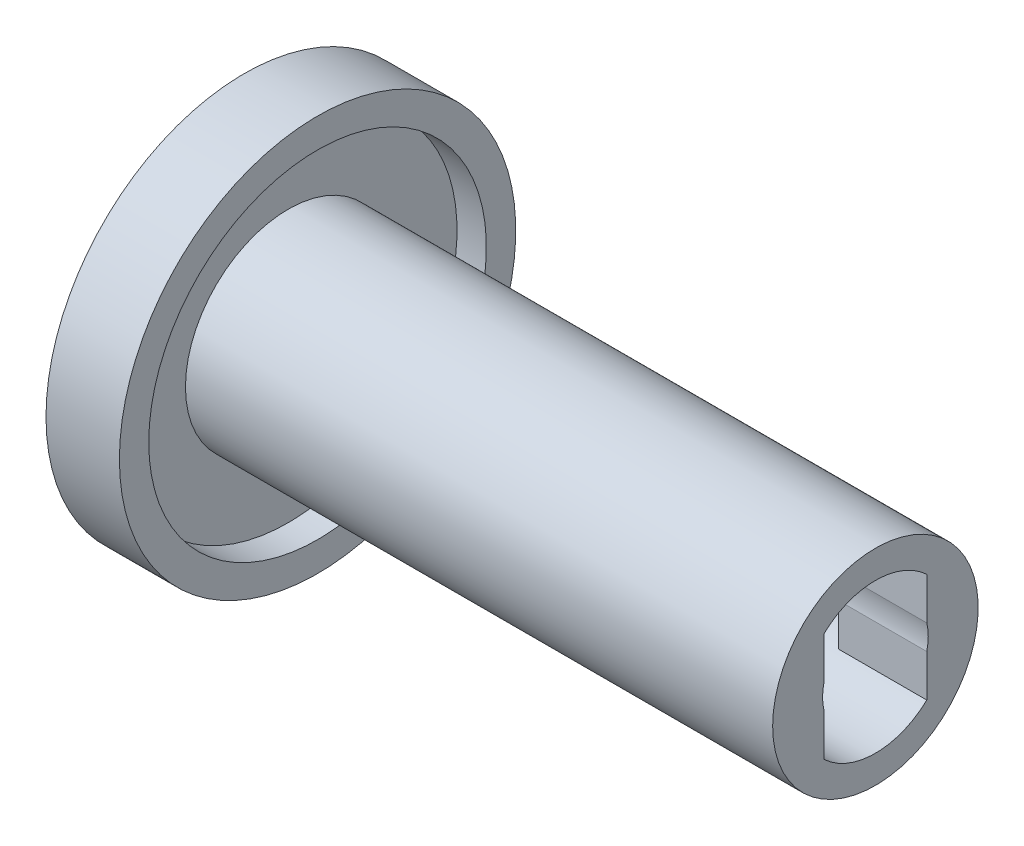
ISO-10303-21;
HEADER;
FILE_DESCRIPTION(('STEP AP214'),'2;1');
FILE_NAME('part.step','',(''),(''),'','','');
FILE_SCHEMA(('AUTOMOTIVE_DESIGN { 1 0 10303 214 1 1 1 1 }'));
ENDSEC;
DATA;
#1=APPLICATION_CONTEXT('core data for automotive mechanical design processes');
#2=APPLICATION_PROTOCOL_DEFINITION('international standard','automotive_design',2000,#1);
#3=PRODUCT_CONTEXT('',#1,'mechanical');
#4=PRODUCT('Part','Part','',(#3));
#5=PRODUCT_RELATED_PRODUCT_CATEGORY('part','',(#4));
#6=PRODUCT_DEFINITION_FORMATION('','',#4);
#7=PRODUCT_DEFINITION_CONTEXT('part definition',#1,'design');
#8=PRODUCT_DEFINITION('design','',#6,#7);
#9=PRODUCT_DEFINITION_SHAPE('','',#8);
#10=(LENGTH_UNIT() NAMED_UNIT(*) SI_UNIT(.MILLI.,.METRE.));
#11=(NAMED_UNIT(*) PLANE_ANGLE_UNIT() SI_UNIT($,.RADIAN.));
#12=(NAMED_UNIT(*) SI_UNIT($,.STERADIAN.) SOLID_ANGLE_UNIT());
#13=UNCERTAINTY_MEASURE_WITH_UNIT(LENGTH_MEASURE(1.E-05),#10,'distance_accuracy_value','');
#14=(GEOMETRIC_REPRESENTATION_CONTEXT(3) GLOBAL_UNCERTAINTY_ASSIGNED_CONTEXT((#13)) GLOBAL_UNIT_ASSIGNED_CONTEXT((#10,
#11,#12)) REPRESENTATION_CONTEXT('',''));
#15=CARTESIAN_POINT('',(0.,0.,0.));
#16=DIRECTION('',(0.,0.,1.));
#17=DIRECTION('',(1.,0.,0.));
#18=AXIS2_PLACEMENT_3D('',#15,#16,#17);
#19=CARTESIAN_POINT('',(-81.7411579050491,0.,0.));
#20=DIRECTION('',(-1.,0.,0.));
#21=DIRECTION('',(0.,0.,1.));
#22=AXIS2_PLACEMENT_3D('',#19,#20,#21);
#23=CYLINDRICAL_SURFACE('',#22,3.6);
#24=CARTESIAN_POINT('',(-25.3586044365278,0.,0.));
#25=DIRECTION('',(-1.,0.,0.));
#26=DIRECTION('',(0.,0.,1.));
#27=AXIS2_PLACEMENT_3D('',#24,#25,#26);
#28=CIRCLE('',#27,3.6);
#29=CARTESIAN_POINT('',(-25.3586044365278,0.842614977317627,-3.5));
#30=VERTEX_POINT('',#29);
#31=CARTESIAN_POINT('',(-25.3586044365278,-0.842614977317625,-3.5));
#32=VERTEX_POINT('',#31);
#33=EDGE_CURVE('E147',#30,#32,#28,.T.);
#34=ORIENTED_EDGE('',*,*,#33,.T.);
#35=DIRECTION('',(-1.,0.,0.));
#36=VECTOR('',#35,1.);
#37=CARTESIAN_POINT('',(-81.7411579050491,-0.842614977317627,-3.5));
#38=LINE('',#37,#36);
#39=CARTESIAN_POINT('',(-19.3586044365278,-0.842614977317627,-3.5));
#40=VERTEX_POINT('',#39);
#41=EDGE_CURVE('E141',#32,#40,#38,.F.);
#42=ORIENTED_EDGE('',*,*,#41,.T.);
#43=CARTESIAN_POINT('',(-19.3586044365278,0.,0.));
#44=DIRECTION('',(-1.,0.,0.));
#45=DIRECTION('',(0.,0.,1.));
#46=AXIS2_PLACEMENT_3D('',#43,#44,#45);
#47=CIRCLE('',#46,3.6);
#48=CARTESIAN_POINT('',(-19.3586044365278,0.842614977317629,-3.5));
#49=VERTEX_POINT('',#48);
#50=EDGE_CURVE('E152',#49,#40,#47,.T.);
#51=ORIENTED_EDGE('',*,*,#50,.F.);
#52=DIRECTION('',(-1.,0.,0.));
#53=VECTOR('',#52,1.);
#54=CARTESIAN_POINT('',(-81.7411579050491,0.842614977317629,-3.5));
#55=LINE('',#54,#53);
#56=EDGE_CURVE('E216',#49,#30,#55,.T.);
#57=ORIENTED_EDGE('',*,*,#56,.T.);
#58=EDGE_LOOP('',(#34,#42,#51,#57));
#59=FACE_BOUND('',#58,.T.);
#60=ADVANCED_FACE('F39',(#59),#23,.F.);
#61=CARTESIAN_POINT('',(-25.3586044365278,3.6,0.));
#62=DIRECTION('',(1.,0.,0.));
#63=DIRECTION('',(0.,0.,-1.));
#64=AXIS2_PLACEMENT_3D('',#61,#62,#63);
#65=PLANE('',#64);
#66=CARTESIAN_POINT('',(-25.3586044365278,0.,0.));
#67=DIRECTION('',(-1.,0.,0.));
#68=DIRECTION('',(0.,0.,1.));
#69=AXIS2_PLACEMENT_3D('',#66,#67,#68);
#70=CIRCLE('',#69,5.1);
#71=CARTESIAN_POINT('',(-25.3586044365278,3.70944739819828,-3.5));
#72=VERTEX_POINT('',#71);
#73=CARTESIAN_POINT('',(-25.3586044365278,-3.70944739819828,-3.5));
#74=VERTEX_POINT('',#73);
#75=EDGE_CURVE('E134',#72,#74,#70,.T.);
#76=ORIENTED_EDGE('',*,*,#75,.T.);
#77=DIRECTION('',(0.,1.,0.));
#78=VECTOR('',#77,1.);
#79=CARTESIAN_POINT('',(-25.3586044365278,3.70944739819828,-3.5));
#80=LINE('',#79,#78);
#81=EDGE_CURVE('E55',#74,#32,#80,.T.);
#82=ORIENTED_EDGE('',*,*,#81,.T.);
#83=ORIENTED_EDGE('',*,*,#33,.F.);
#84=EDGE_CURVE('E220',#30,#72,#80,.T.);
#85=ORIENTED_EDGE('',*,*,#84,.T.);
#86=EDGE_LOOP('',(#76,#82,#83,#85));
#87=FACE_BOUND('',#86,.T.);
#88=ADVANCED_FACE('F219',(#87),#65,.F.);
#89=CARTESIAN_POINT('',(-59.3586044365278,5.1,0.));
#90=DIRECTION('',(-1.,0.,0.));
#91=DIRECTION('',(0.,0.,1.));
#92=AXIS2_PLACEMENT_3D('',#89,#90,#91);
#93=PLANE('',#92);
#94=CARTESIAN_POINT('',(-59.3586044365278,0.,0.));
#95=DIRECTION('',(-1.,0.,0.));
#96=DIRECTION('',(0.,0.,1.));
#97=AXIS2_PLACEMENT_3D('',#94,#95,#96);
#98=CIRCLE('',#97,5.1);
#99=CARTESIAN_POINT('',(-59.3586044365278,0.,5.1));
#100=VERTEX_POINT('',#99);
#101=EDGE_CURVE('E135',#100,#100,#98,.T.);
#102=ORIENTED_EDGE('',*,*,#101,.F.);
#103=EDGE_LOOP('',(#102));
#104=FACE_BOUND('',#103,.T.);
#105=ADVANCED_FACE('F41',(#104),#93,.F.);
#106=CARTESIAN_POINT('',(-62.3586044365278,0.,0.));
#107=DIRECTION('',(1.,0.,0.));
#108=DIRECTION('',(0.,0.,-1.));
#109=AXIS2_PLACEMENT_3D('',#106,#107,#108);
#110=PLANE('',#109);
#111=CARTESIAN_POINT('',(-62.3586044365278,0.,0.));
#112=DIRECTION('',(-1.,0.,0.));
#113=DIRECTION('',(0.,0.,1.));
#114=AXIS2_PLACEMENT_3D('',#111,#112,#113);
#115=CIRCLE('',#114,13.5);
#116=CARTESIAN_POINT('',(-62.3586044365278,0.,13.5));
#117=VERTEX_POINT('',#116);
#118=EDGE_CURVE('E11',#117,#117,#115,.T.);
#119=ORIENTED_EDGE('',*,*,#118,.T.);
#120=EDGE_LOOP('',(#119));
#121=FACE_BOUND('',#120,.T.);
#122=ADVANCED_FACE('F371',(#121),#110,.F.);
#123=CARTESIAN_POINT('',(-81.7411579050491,0.,0.));
#124=DIRECTION('',(-1.,0.,0.));
#125=DIRECTION('',(0.,0.,1.));
#126=AXIS2_PLACEMENT_3D('',#123,#124,#125);
#127=CYLINDRICAL_SURFACE('',#126,13.5);
#128=ORIENTED_EDGE('',*,*,#118,.F.);
#129=EDGE_LOOP('',(#128));
#130=FACE_BOUND('',#129,.T.);
#131=CARTESIAN_POINT('',(-57.3586044365278,0.,0.));
#132=DIRECTION('',(-1.,0.,0.));
#133=DIRECTION('',(0.,0.,1.));
#134=AXIS2_PLACEMENT_3D('',#131,#132,#133);
#135=CIRCLE('',#134,13.5);
#136=CARTESIAN_POINT('',(-57.3586044365278,0.,13.5));
#137=VERTEX_POINT('',#136);
#138=EDGE_CURVE('E48',#137,#137,#135,.T.);
#139=ORIENTED_EDGE('',*,*,#138,.T.);
#140=EDGE_LOOP('',(#139));
#141=FACE_BOUND('',#140,.T.);
#142=ADVANCED_FACE('F172',(#130,#141),#127,.T.);
#143=CARTESIAN_POINT('',(-57.3586044365278,13.5,0.));
#144=DIRECTION('',(-1.,0.,0.));
#145=DIRECTION('',(0.,0.,1.));
#146=AXIS2_PLACEMENT_3D('',#143,#144,#145);
#147=PLANE('',#146);
#148=ORIENTED_EDGE('',*,*,#138,.F.);
#149=EDGE_LOOP('',(#148));
#150=FACE_BOUND('',#149,.T.);
#151=CARTESIAN_POINT('',(-57.3586044365278,0.,0.));
#152=DIRECTION('',(-1.,0.,0.));
#153=DIRECTION('',(0.,0.,1.));
#154=AXIS2_PLACEMENT_3D('',#151,#152,#153);
#155=CIRCLE('',#154,11.5);
#156=CARTESIAN_POINT('',(-57.3586044365278,0.,11.5));
#157=VERTEX_POINT('',#156);
#158=EDGE_CURVE('E165',#157,#157,#155,.T.);
#159=ORIENTED_EDGE('',*,*,#158,.T.);
#160=EDGE_LOOP('',(#159));
#161=FACE_BOUND('',#160,.T.);
#162=ADVANCED_FACE('F174',(#150,#161),#147,.F.);
#163=CARTESIAN_POINT('',(-81.7411579050491,0.,0.));
#164=DIRECTION('',(-1.,0.,0.));
#165=DIRECTION('',(0.,0.,1.));
#166=AXIS2_PLACEMENT_3D('',#163,#164,#165);
#167=CYLINDRICAL_SURFACE('',#166,11.5);
#168=ORIENTED_EDGE('',*,*,#158,.F.);
#169=EDGE_LOOP('',(#168));
#170=FACE_BOUND('',#169,.T.);
#171=CARTESIAN_POINT('',(-59.3586044365278,0.,0.));
#172=DIRECTION('',(-1.,0.,0.));
#173=DIRECTION('',(0.,0.,1.));
#174=AXIS2_PLACEMENT_3D('',#171,#172,#173);
#175=CIRCLE('',#174,11.5);
#176=CARTESIAN_POINT('',(-59.3586044365278,0.,11.5));
#177=VERTEX_POINT('',#176);
#178=EDGE_CURVE('E161',#177,#177,#175,.T.);
#179=ORIENTED_EDGE('',*,*,#178,.T.);
#180=EDGE_LOOP('',(#179));
#181=FACE_BOUND('',#180,.T.);
#182=ADVANCED_FACE('F177',(#170,#181),#167,.F.);
#183=CARTESIAN_POINT('',(-59.3586044365278,11.5,0.));
#184=DIRECTION('',(-1.,0.,0.));
#185=DIRECTION('',(0.,0.,1.));
#186=AXIS2_PLACEMENT_3D('',#183,#184,#185);
#187=PLANE('',#186);
#188=ORIENTED_EDGE('',*,*,#178,.F.);
#189=EDGE_LOOP('',(#188));
#190=FACE_BOUND('',#189,.T.);
#191=CARTESIAN_POINT('',(-59.3586044365278,0.,0.));
#192=DIRECTION('',(-1.,0.,0.));
#193=DIRECTION('',(0.,0.,1.));
#194=AXIS2_PLACEMENT_3D('',#191,#192,#193);
#195=CIRCLE('',#194,7.);
#196=CARTESIAN_POINT('',(-59.3586044365278,0.,7.));
#197=VERTEX_POINT('',#196);
#198=EDGE_CURVE('E157',#197,#197,#195,.T.);
#199=ORIENTED_EDGE('',*,*,#198,.T.);
#200=EDGE_LOOP('',(#199));
#201=FACE_BOUND('',#200,.T.);
#202=ADVANCED_FACE('F183',(#190,#201),#187,.F.);
#203=CARTESIAN_POINT('',(-81.7411579050491,0.,0.));
#204=DIRECTION('',(-1.,0.,0.));
#205=DIRECTION('',(0.,0.,1.));
#206=AXIS2_PLACEMENT_3D('',#203,#204,#205);
#207=CYLINDRICAL_SURFACE('',#206,7.);
#208=ORIENTED_EDGE('',*,*,#198,.F.);
#209=EDGE_LOOP('',(#208));
#210=FACE_BOUND('',#209,.T.);
#211=CARTESIAN_POINT('',(-19.3586044365278,0.,0.));
#212=DIRECTION('',(-1.,0.,0.));
#213=DIRECTION('',(0.,0.,1.));
#214=AXIS2_PLACEMENT_3D('',#211,#212,#213);
#215=CIRCLE('',#214,7.);
#216=CARTESIAN_POINT('',(-19.3586044365278,0.,7.));
#217=VERTEX_POINT('',#216);
#218=EDGE_CURVE('E153',#217,#217,#215,.T.);
#219=ORIENTED_EDGE('',*,*,#218,.T.);
#220=EDGE_LOOP('',(#219));
#221=FACE_BOUND('',#220,.T.);
#222=ADVANCED_FACE('F189',(#210,#221),#207,.T.);
#223=CARTESIAN_POINT('',(-19.3586044365278,7.,0.));
#224=DIRECTION('',(-1.,0.,0.));
#225=DIRECTION('',(0.,0.,1.));
#226=AXIS2_PLACEMENT_3D('',#223,#224,#225);
#227=PLANE('',#226);
#228=ORIENTED_EDGE('',*,*,#218,.F.);
#229=EDGE_LOOP('',(#228));
#230=FACE_BOUND('',#229,.T.);
#231=ORIENTED_EDGE('',*,*,#50,.T.);
#232=DIRECTION('',(0.,1.,0.));
#233=VECTOR('',#232,1.);
#234=CARTESIAN_POINT('',(-19.3586044365278,3.70944739819828,-3.5));
#235=LINE('',#234,#233);
#236=CARTESIAN_POINT('',(-19.3586044365278,-3.70944739819828,-3.5));
#237=VERTEX_POINT('',#236);
#238=EDGE_CURVE('E127',#237,#40,#235,.T.);
#239=ORIENTED_EDGE('',*,*,#238,.F.);
#240=CARTESIAN_POINT('',(-19.3586044365278,0.,0.));
#241=DIRECTION('',(1.,0.,0.));
#242=DIRECTION('',(0.,0.,-1.));
#243=AXIS2_PLACEMENT_3D('',#240,#241,#242);
#244=CIRCLE('',#243,5.1);
#245=CARTESIAN_POINT('',(-19.3586044365278,-3.70944739819828,3.5));
#246=VERTEX_POINT('',#245);
#247=EDGE_CURVE('E233',#246,#237,#244,.T.);
#248=ORIENTED_EDGE('',*,*,#247,.F.);
#249=DIRECTION('',(0.,-1.,0.));
#250=VECTOR('',#249,1.);
#251=CARTESIAN_POINT('',(-19.3586044365278,3.70944739819828,3.5));
#252=LINE('',#251,#250);
#253=CARTESIAN_POINT('',(-19.3586044365278,-0.842614977317643,3.5));
#254=VERTEX_POINT('',#253);
#255=EDGE_CURVE('E110',#254,#246,#252,.T.);
#256=ORIENTED_EDGE('',*,*,#255,.F.);
#257=CARTESIAN_POINT('',(-19.3586044365278,0.842614977317642,3.5));
#258=VERTEX_POINT('',#257);
#259=EDGE_CURVE('E148',#254,#258,#47,.T.);
#260=ORIENTED_EDGE('',*,*,#259,.T.);
#261=CARTESIAN_POINT('',(-19.3586044365278,3.70944739819828,3.5));
#262=VERTEX_POINT('',#261);
#263=EDGE_CURVE('E230',#262,#258,#252,.T.);
#264=ORIENTED_EDGE('',*,*,#263,.F.);
#265=CARTESIAN_POINT('',(-19.3586044365278,0.,0.));
#266=DIRECTION('',(1.,0.,0.));
#267=DIRECTION('',(0.,0.,1.));
#268=AXIS2_PLACEMENT_3D('',#265,#266,#267);
#269=CIRCLE('',#268,5.1);
#270=CARTESIAN_POINT('',(-19.3586044365278,3.70944739819828,-3.5));
#271=VERTEX_POINT('',#270);
#272=EDGE_CURVE('E227',#271,#262,#269,.T.);
#273=ORIENTED_EDGE('',*,*,#272,.F.);
#274=EDGE_CURVE('E208',#49,#271,#235,.T.);
#275=ORIENTED_EDGE('',*,*,#274,.F.);
#276=EDGE_LOOP('',(#231,#239,#248,#256,#260,#264,#273,#275));
#277=FACE_BOUND('',#276,.T.);
#278=ADVANCED_FACE('F195',(#230,#277),#227,.F.);
#279=CARTESIAN_POINT('',(-25.3586044365278,-0.842614977317642,3.5));
#280=VERTEX_POINT('',#279);
#281=CARTESIAN_POINT('',(-25.3586044365278,0.842614977317641,3.5));
#282=VERTEX_POINT('',#281);
#283=EDGE_CURVE('E125',#280,#282,#28,.T.);
#284=ORIENTED_EDGE('',*,*,#283,.T.);
#285=DIRECTION('',(-1.,0.,0.));
#286=VECTOR('',#285,1.);
#287=CARTESIAN_POINT('',(-81.7411579050491,0.842614977317642,3.5));
#288=LINE('',#287,#286);
#289=EDGE_CURVE('E247',#282,#258,#288,.F.);
#290=ORIENTED_EDGE('',*,*,#289,.T.);
#291=ORIENTED_EDGE('',*,*,#259,.F.);
#292=DIRECTION('',(-1.,0.,0.));
#293=VECTOR('',#292,1.);
#294=CARTESIAN_POINT('',(-81.7411579050491,-0.842614977317643,3.5));
#295=LINE('',#294,#293);
#296=EDGE_CURVE('E242',#254,#280,#295,.T.);
#297=ORIENTED_EDGE('',*,*,#296,.T.);
#298=EDGE_LOOP('',(#284,#290,#291,#297));
#299=FACE_BOUND('',#298,.T.);
#300=ADVANCED_FACE('F201',(#299),#23,.F.);
#301=CARTESIAN_POINT('',(-25.3586044365278,-3.70944739819828,3.5));
#302=VERTEX_POINT('',#301);
#303=CARTESIAN_POINT('',(-25.3586044365278,3.70944739819828,3.5));
#304=VERTEX_POINT('',#303);
#305=EDGE_CURVE('E123',#302,#304,#70,.T.);
#306=ORIENTED_EDGE('',*,*,#305,.T.);
#307=DIRECTION('',(0.,-1.,0.));
#308=VECTOR('',#307,1.);
#309=CARTESIAN_POINT('',(-25.3586044365278,3.70944739819828,3.5));
#310=LINE('',#309,#308);
#311=EDGE_CURVE('E63',#304,#282,#310,.T.);
#312=ORIENTED_EDGE('',*,*,#311,.T.);
#313=ORIENTED_EDGE('',*,*,#283,.F.);
#314=EDGE_CURVE('E107',#280,#302,#310,.T.);
#315=ORIENTED_EDGE('',*,*,#314,.T.);
#316=EDGE_LOOP('',(#306,#312,#313,#315));
#317=FACE_BOUND('',#316,.T.);
#318=ADVANCED_FACE('F122',(#317),#65,.F.);
#319=CARTESIAN_POINT('',(-81.7411579050491,0.,0.));
#320=DIRECTION('',(-1.,0.,0.));
#321=DIRECTION('',(0.,0.,1.));
#322=AXIS2_PLACEMENT_3D('',#319,#320,#321);
#323=CYLINDRICAL_SURFACE('',#322,5.1);
#324=ORIENTED_EDGE('',*,*,#75,.F.);
#325=DIRECTION('',(1.,0.,0.));
#326=VECTOR('',#325,1.);
#327=CARTESIAN_POINT('',(-25.3586044365278,3.70944739819828,-3.5));
#328=LINE('',#327,#326);
#329=EDGE_CURVE('E238',#72,#271,#328,.T.);
#330=ORIENTED_EDGE('',*,*,#329,.T.);
#331=ORIENTED_EDGE('',*,*,#272,.T.);
#332=DIRECTION('',(1.,0.,0.));
#333=VECTOR('',#332,1.);
#334=CARTESIAN_POINT('',(-25.3586044365278,3.70944739819828,3.5));
#335=LINE('',#334,#333);
#336=EDGE_CURVE('E117',#304,#262,#335,.T.);
#337=ORIENTED_EDGE('',*,*,#336,.F.);
#338=ORIENTED_EDGE('',*,*,#305,.F.);
#339=DIRECTION('',(1.,0.,0.));
#340=VECTOR('',#339,1.);
#341=CARTESIAN_POINT('',(-25.3586044365278,-3.70944739819828,3.5));
#342=LINE('',#341,#340);
#343=EDGE_CURVE('E104',#302,#246,#342,.T.);
#344=ORIENTED_EDGE('',*,*,#343,.T.);
#345=ORIENTED_EDGE('',*,*,#247,.T.);
#346=DIRECTION('',(1.,0.,0.));
#347=VECTOR('',#346,1.);
#348=CARTESIAN_POINT('',(-25.3586044365278,-3.70944739819828,-3.5));
#349=LINE('',#348,#347);
#350=EDGE_CURVE('E116',#74,#237,#349,.T.);
#351=ORIENTED_EDGE('',*,*,#350,.F.);
#352=EDGE_LOOP('',(#324,#330,#331,#337,#338,#344,#345,#351));
#353=FACE_BOUND('',#352,.T.);
#354=ORIENTED_EDGE('',*,*,#101,.T.);
#355=EDGE_LOOP('',(#354));
#356=FACE_BOUND('',#355,.T.);
#357=ADVANCED_FACE('F130',(#353,#356),#323,.F.);
#358=CARTESIAN_POINT('',(-25.3586044365278,3.70944739819828,3.5));
#359=DIRECTION('',(0.,0.,1.));
#360=DIRECTION('',(0.,-1.,0.));
#361=AXIS2_PLACEMENT_3D('',#358,#359,#360);
#362=PLANE('',#361);
#363=ORIENTED_EDGE('',*,*,#311,.F.);
#364=ORIENTED_EDGE('',*,*,#336,.T.);
#365=ORIENTED_EDGE('',*,*,#263,.T.);
#366=ORIENTED_EDGE('',*,*,#289,.F.);
#367=EDGE_LOOP('',(#363,#364,#365,#366));
#368=FACE_BOUND('',#367,.T.);
#369=ADVANCED_FACE('F269',(#368),#362,.F.);
#370=CARTESIAN_POINT('',(-25.3586044365278,3.70944739819828,-3.5));
#371=DIRECTION('',(0.,0.,-1.));
#372=DIRECTION('',(0.,1.,0.));
#373=AXIS2_PLACEMENT_3D('',#370,#371,#372);
#374=PLANE('',#373);
#375=ORIENTED_EDGE('',*,*,#274,.T.);
#376=ORIENTED_EDGE('',*,*,#329,.F.);
#377=ORIENTED_EDGE('',*,*,#84,.F.);
#378=ORIENTED_EDGE('',*,*,#56,.F.);
#379=EDGE_LOOP('',(#375,#376,#377,#378));
#380=FACE_BOUND('',#379,.T.);
#381=ADVANCED_FACE('F260',(#380),#374,.F.);
#382=ORIENTED_EDGE('',*,*,#81,.F.);
#383=ORIENTED_EDGE('',*,*,#350,.T.);
#384=ORIENTED_EDGE('',*,*,#238,.T.);
#385=ORIENTED_EDGE('',*,*,#41,.F.);
#386=EDGE_LOOP('',(#382,#383,#384,#385));
#387=FACE_BOUND('',#386,.T.);
#388=ADVANCED_FACE('F261',(#387),#374,.F.);
#389=ORIENTED_EDGE('',*,*,#255,.T.);
#390=ORIENTED_EDGE('',*,*,#343,.F.);
#391=ORIENTED_EDGE('',*,*,#314,.F.);
#392=ORIENTED_EDGE('',*,*,#296,.F.);
#393=EDGE_LOOP('',(#389,#390,#391,#392));
#394=FACE_BOUND('',#393,.T.);
#395=ADVANCED_FACE('F106',(#394),#362,.F.);
#396=CLOSED_SHELL('',(#60,#88,#105,#122,#142,#162,#182,#202,#222,#278,#300,#318,#357,#369,#381,
#388,#395));
#397=MANIFOLD_SOLID_BREP('B2',#396);
#398=ADVANCED_BREP_SHAPE_REPRESENTATION('',(#18,#397),#14);
#399=SHAPE_DEFINITION_REPRESENTATION(#9,#398);
ENDSEC;
END-ISO-10303-21;
